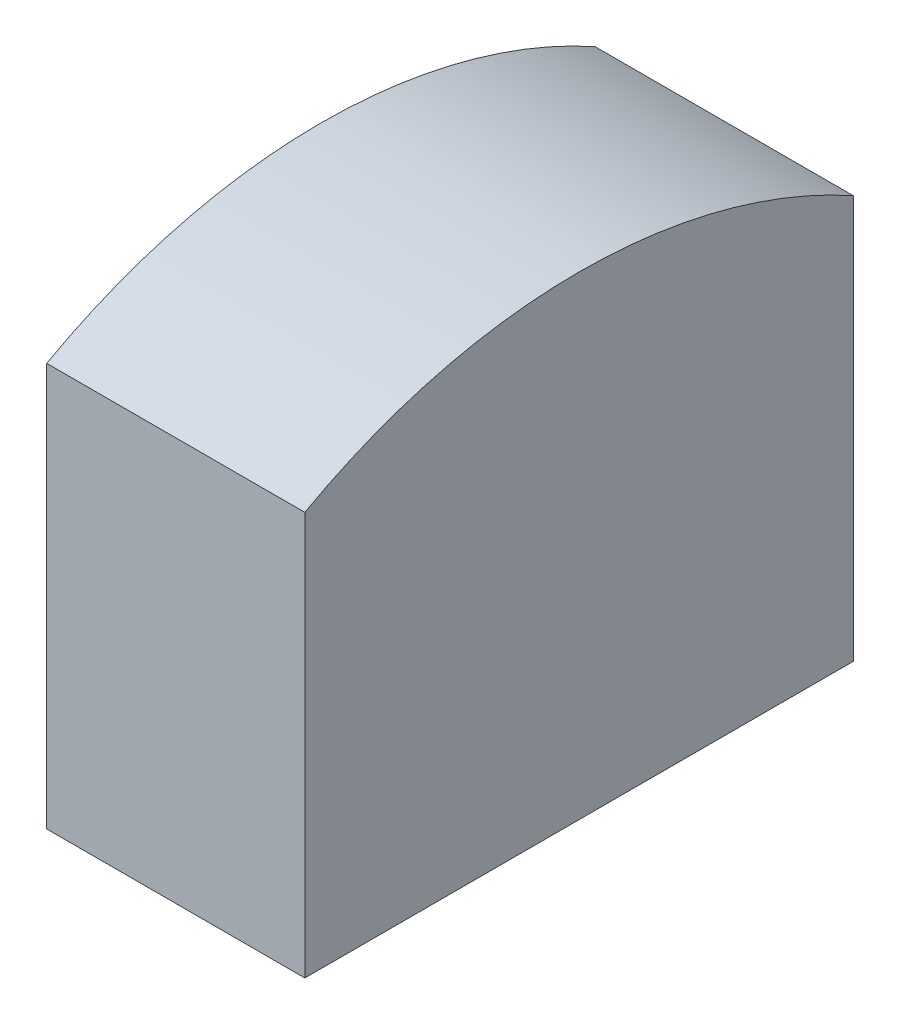
ISO-10303-21;
HEADER;
FILE_DESCRIPTION(('STEP AP214'),'2;1');
FILE_NAME('part.step','',(''),(''),'','','');
FILE_SCHEMA(('AUTOMOTIVE_DESIGN { 1 0 10303 214 1 1 1 1 }'));
ENDSEC;
DATA;
#1=APPLICATION_CONTEXT('core data for automotive mechanical design processes');
#2=APPLICATION_PROTOCOL_DEFINITION('international standard','automotive_design',2000,#1);
#3=PRODUCT_CONTEXT('',#1,'mechanical');
#4=PRODUCT('Part','Part','',(#3));
#5=PRODUCT_RELATED_PRODUCT_CATEGORY('part','',(#4));
#6=PRODUCT_DEFINITION_FORMATION('','',#4);
#7=PRODUCT_DEFINITION_CONTEXT('part definition',#1,'design');
#8=PRODUCT_DEFINITION('design','',#6,#7);
#9=PRODUCT_DEFINITION_SHAPE('','',#8);
#10=(LENGTH_UNIT() NAMED_UNIT(*) SI_UNIT(.MILLI.,.METRE.));
#11=(NAMED_UNIT(*) PLANE_ANGLE_UNIT() SI_UNIT($,.RADIAN.));
#12=(NAMED_UNIT(*) SI_UNIT($,.STERADIAN.) SOLID_ANGLE_UNIT());
#13=UNCERTAINTY_MEASURE_WITH_UNIT(LENGTH_MEASURE(1.E-05),#10,'distance_accuracy_value','');
#14=(GEOMETRIC_REPRESENTATION_CONTEXT(3) GLOBAL_UNCERTAINTY_ASSIGNED_CONTEXT((#13)) GLOBAL_UNIT_ASSIGNED_CONTEXT((#10,
#11,#12)) REPRESENTATION_CONTEXT('',''));
#15=CARTESIAN_POINT('',(0.,0.,0.));
#16=DIRECTION('',(0.,0.,1.));
#17=DIRECTION('',(1.,0.,0.));
#18=AXIS2_PLACEMENT_3D('',#15,#16,#17);
#19=CARTESIAN_POINT('',(0.,25.,0.));
#20=DIRECTION('',(1.,0.,0.));
#21=DIRECTION('',(0.,0.,-1.));
#22=AXIS2_PLACEMENT_3D('',#19,#20,#21);
#23=PLANE('',#22);
#24=DIRECTION('',(0.,0.,1.));
#25=VECTOR('',#24,1.);
#26=CARTESIAN_POINT('',(0.,0.,0.));
#27=LINE('',#26,#25);
#28=CARTESIAN_POINT('',(0.,0.,-34.));
#29=VERTEX_POINT('',#28);
#30=CARTESIAN_POINT('',(0.,0.,0.));
#31=VERTEX_POINT('',#30);
#32=EDGE_CURVE('E116',#29,#31,#27,.T.);
#33=ORIENTED_EDGE('',*,*,#32,.T.);
#34=DIRECTION('',(0.,-1.,0.));
#35=VECTOR('',#34,1.);
#36=CARTESIAN_POINT('',(0.,25.,0.));
#37=LINE('',#36,#35);
#38=CARTESIAN_POINT('',(0.,25.,0.));
#39=VERTEX_POINT('',#38);
#40=EDGE_CURVE('E11',#39,#31,#37,.T.);
#41=ORIENTED_EDGE('',*,*,#40,.F.);
#42=CARTESIAN_POINT('',(0.,-5.59411708155671,-17.));
#43=DIRECTION('',(1.,0.,0.));
#44=DIRECTION('',(0.,0.,-1.));
#45=AXIS2_PLACEMENT_3D('',#42,#43,#44);
#46=CIRCLE('',#45,35.);
#47=CARTESIAN_POINT('',(0.,25.,-34.));
#48=VERTEX_POINT('',#47);
#49=EDGE_CURVE('E110',#39,#48,#46,.F.);
#50=ORIENTED_EDGE('',*,*,#49,.T.);
#51=DIRECTION('',(0.,-1.,0.));
#52=VECTOR('',#51,1.);
#53=CARTESIAN_POINT('',(0.,25.,-34.));
#54=LINE('',#53,#52);
#55=EDGE_CURVE('E61',#48,#29,#54,.T.);
#56=ORIENTED_EDGE('',*,*,#55,.T.);
#57=EDGE_LOOP('',(#33,#41,#50,#56));
#58=FACE_BOUND('',#57,.T.);
#59=ADVANCED_FACE('F44',(#58),#23,.F.);
#60=CARTESIAN_POINT('',(0.,25.,0.));
#61=DIRECTION('',(0.,0.,-1.));
#62=DIRECTION('',(-1.,0.,0.));
#63=AXIS2_PLACEMENT_3D('',#60,#61,#62);
#64=PLANE('',#63);
#65=DIRECTION('',(1.,0.,0.));
#66=VECTOR('',#65,1.);
#67=CARTESIAN_POINT('',(0.,0.,0.));
#68=LINE('',#67,#66);
#69=CARTESIAN_POINT('',(16.,0.,0.));
#70=VERTEX_POINT('',#69);
#71=EDGE_CURVE('E128',#31,#70,#68,.T.);
#72=ORIENTED_EDGE('',*,*,#71,.T.);
#73=DIRECTION('',(0.,-1.,0.));
#74=VECTOR('',#73,1.);
#75=CARTESIAN_POINT('',(16.,25.,0.));
#76=LINE('',#75,#74);
#77=CARTESIAN_POINT('',(16.,25.,0.));
#78=VERTEX_POINT('',#77);
#79=EDGE_CURVE('E53',#78,#70,#76,.T.);
#80=ORIENTED_EDGE('',*,*,#79,.F.);
#81=DIRECTION('',(1.,0.,0.));
#82=VECTOR('',#81,1.);
#83=CARTESIAN_POINT('',(0.,25.,0.));
#84=LINE('',#83,#82);
#85=EDGE_CURVE('E118',#39,#78,#84,.T.);
#86=ORIENTED_EDGE('',*,*,#85,.F.);
#87=ORIENTED_EDGE('',*,*,#40,.T.);
#88=EDGE_LOOP('',(#72,#80,#86,#87));
#89=FACE_BOUND('',#88,.T.);
#90=ADVANCED_FACE('F158',(#89),#64,.F.);
#91=CARTESIAN_POINT('',(16.,25.,0.));
#92=DIRECTION('',(-1.,0.,0.));
#93=DIRECTION('',(0.,0.,1.));
#94=AXIS2_PLACEMENT_3D('',#91,#92,#93);
#95=PLANE('',#94);
#96=DIRECTION('',(0.,0.,-1.));
#97=VECTOR('',#96,1.);
#98=CARTESIAN_POINT('',(16.,0.,0.));
#99=LINE('',#98,#97);
#100=CARTESIAN_POINT('',(16.,0.,-34.));
#101=VERTEX_POINT('',#100);
#102=EDGE_CURVE('E79',#70,#101,#99,.T.);
#103=ORIENTED_EDGE('',*,*,#102,.T.);
#104=DIRECTION('',(0.,-1.,0.));
#105=VECTOR('',#104,1.);
#106=CARTESIAN_POINT('',(16.,25.,-34.));
#107=LINE('',#106,#105);
#108=CARTESIAN_POINT('',(16.,25.,-34.));
#109=VERTEX_POINT('',#108);
#110=EDGE_CURVE('E137',#109,#101,#107,.T.);
#111=ORIENTED_EDGE('',*,*,#110,.F.);
#112=CARTESIAN_POINT('',(16.,-5.59411708155671,-17.));
#113=DIRECTION('',(1.,0.,0.));
#114=DIRECTION('',(0.,0.,1.));
#115=AXIS2_PLACEMENT_3D('',#112,#113,#114);
#116=CIRCLE('',#115,35.);
#117=EDGE_CURVE('E104',#109,#78,#116,.T.);
#118=ORIENTED_EDGE('',*,*,#117,.T.);
#119=ORIENTED_EDGE('',*,*,#79,.T.);
#120=EDGE_LOOP('',(#103,#111,#118,#119));
#121=FACE_BOUND('',#120,.T.);
#122=ADVANCED_FACE('F140',(#121),#95,.F.);
#123=CARTESIAN_POINT('',(0.,25.,-34.));
#124=DIRECTION('',(0.,0.,1.));
#125=DIRECTION('',(1.,0.,0.));
#126=AXIS2_PLACEMENT_3D('',#123,#124,#125);
#127=PLANE('',#126);
#128=DIRECTION('',(-1.,0.,0.));
#129=VECTOR('',#128,1.);
#130=CARTESIAN_POINT('',(0.,0.,-34.));
#131=LINE('',#130,#129);
#132=EDGE_CURVE('E82',#101,#29,#131,.T.);
#133=ORIENTED_EDGE('',*,*,#132,.T.);
#134=ORIENTED_EDGE('',*,*,#55,.F.);
#135=DIRECTION('',(-1.,0.,0.));
#136=VECTOR('',#135,1.);
#137=CARTESIAN_POINT('',(0.,25.,-34.));
#138=LINE('',#137,#136);
#139=EDGE_CURVE('E121',#109,#48,#138,.T.);
#140=ORIENTED_EDGE('',*,*,#139,.F.);
#141=ORIENTED_EDGE('',*,*,#110,.T.);
#142=EDGE_LOOP('',(#133,#134,#140,#141));
#143=FACE_BOUND('',#142,.T.);
#144=ADVANCED_FACE('F148',(#143),#127,.F.);
#145=CARTESIAN_POINT('',(0.,0.,0.));
#146=DIRECTION('',(0.,-1.,0.));
#147=DIRECTION('',(0.,0.,-1.));
#148=AXIS2_PLACEMENT_3D('',#145,#146,#147);
#149=PLANE('',#148);
#150=CARTESIAN_POINT('',(8.,0.,-17.));
#151=DIRECTION('',(0.,-1.,0.));
#152=DIRECTION('',(0.,0.,-1.));
#153=AXIS2_PLACEMENT_3D('',#150,#151,#152);
#154=CIRCLE('',#153,4.19999999999999);
#155=CARTESIAN_POINT('',(8.,0.,-21.2));
#156=VERTEX_POINT('',#155);
#157=EDGE_CURVE('E105',#156,#156,#154,.T.);
#158=ORIENTED_EDGE('',*,*,#157,.F.);
#159=EDGE_LOOP('',(#158));
#160=FACE_BOUND('',#159,.T.);
#161=ORIENTED_EDGE('',*,*,#32,.F.);
#162=ORIENTED_EDGE('',*,*,#132,.F.);
#163=ORIENTED_EDGE('',*,*,#102,.F.);
#164=ORIENTED_EDGE('',*,*,#71,.F.);
#165=EDGE_LOOP('',(#161,#162,#163,#164));
#166=FACE_BOUND('',#165,.T.);
#167=ADVANCED_FACE('F144',(#160,#166),#149,.T.);
#168=CARTESIAN_POINT('',(-34.2842792587365,-5.59411708155671,-17.));
#169=DIRECTION('',(1.,0.,0.));
#170=DIRECTION('',(0.,0.,-1.));
#171=AXIS2_PLACEMENT_3D('',#168,#169,#170);
#172=CYLINDRICAL_SURFACE('',#171,35.);
#173=ORIENTED_EDGE('',*,*,#49,.F.);
#174=ORIENTED_EDGE('',*,*,#85,.T.);
#175=ORIENTED_EDGE('',*,*,#117,.F.);
#176=ORIENTED_EDGE('',*,*,#139,.T.);
#177=EDGE_LOOP('',(#173,#174,#175,#176));
#178=FACE_BOUND('',#177,.T.);
#179=ADVANCED_FACE('F97',(#178),#172,.T.);
#180=CARTESIAN_POINT('',(8.,6.,-17.));
#181=DIRECTION('',(0.,-1.,0.));
#182=DIRECTION('',(0.,0.,-1.));
#183=AXIS2_PLACEMENT_3D('',#180,#181,#182);
#184=CONICAL_SURFACE('',#183,4.2,1.02974425867665);
#185=CARTESIAN_POINT('',(8.,8.52361459991575,-17.));
#186=VERTEX_POINT('',#185);
#187=VERTEX_LOOP('',#186);
#188=FACE_BOUND('',#187,.T.);
#189=CARTESIAN_POINT('',(8.,6.,-17.));
#190=DIRECTION('',(0.,-1.,0.));
#191=DIRECTION('',(0.,0.,-1.));
#192=AXIS2_PLACEMENT_3D('',#189,#190,#191);
#193=CIRCLE('',#192,4.2);
#194=CARTESIAN_POINT('',(8.,6.,-21.2));
#195=VERTEX_POINT('',#194);
#196=EDGE_CURVE('E101',#195,#195,#193,.T.);
#197=ORIENTED_EDGE('',*,*,#196,.T.);
#198=EDGE_LOOP('',(#197));
#199=FACE_BOUND('',#198,.T.);
#200=ADVANCED_FACE('F93',(#188,#199),#184,.F.);
#201=CARTESIAN_POINT('',(8.,0.,-17.));
#202=DIRECTION('',(0.,-1.,0.));
#203=DIRECTION('',(0.,0.,-1.));
#204=AXIS2_PLACEMENT_3D('',#201,#202,#203);
#205=CYLINDRICAL_SURFACE('',#204,4.2);
#206=ORIENTED_EDGE('',*,*,#196,.F.);
#207=EDGE_LOOP('',(#206));
#208=FACE_BOUND('',#207,.T.);
#209=ORIENTED_EDGE('',*,*,#157,.T.);
#210=EDGE_LOOP('',(#209));
#211=FACE_BOUND('',#210,.T.);
#212=ADVANCED_FACE('F96',(#208,#211),#205,.F.);
#213=CLOSED_SHELL('',(#59,#90,#122,#144,#167,#179,#200,#212));
#214=MANIFOLD_SOLID_BREP('B2',#213);
#215=ADVANCED_BREP_SHAPE_REPRESENTATION('',(#18,#214),#14);
#216=SHAPE_DEFINITION_REPRESENTATION(#9,#215);
ENDSEC;
END-ISO-10303-21;
